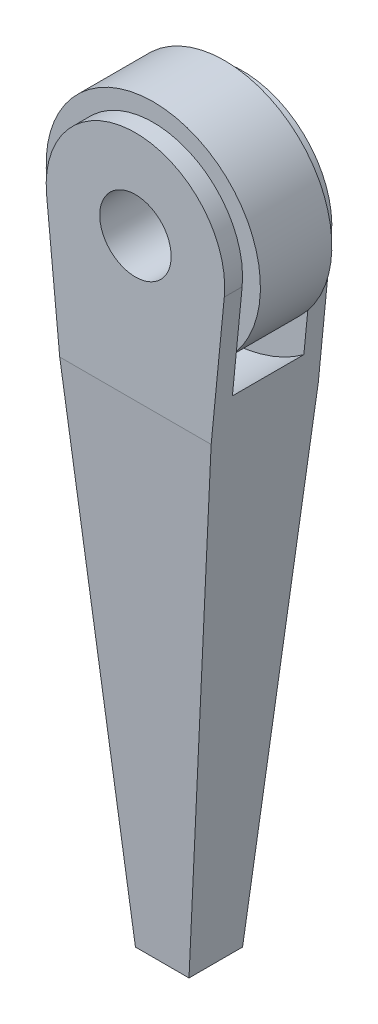
ISO-10303-21;
HEADER;
FILE_DESCRIPTION(('STEP AP214'),'2;1');
FILE_NAME('part.step','',(''),(''),'','','');
FILE_SCHEMA(('AUTOMOTIVE_DESIGN { 1 0 10303 214 1 1 1 1 }'));
ENDSEC;
DATA;
#1=APPLICATION_CONTEXT('core data for automotive mechanical design processes');
#2=APPLICATION_PROTOCOL_DEFINITION('international standard','automotive_design',2000,#1);
#3=PRODUCT_CONTEXT('',#1,'mechanical');
#4=PRODUCT('Part','Part','',(#3));
#5=PRODUCT_RELATED_PRODUCT_CATEGORY('part','',(#4));
#6=PRODUCT_DEFINITION_FORMATION('','',#4);
#7=PRODUCT_DEFINITION_CONTEXT('part definition',#1,'design');
#8=PRODUCT_DEFINITION('design','',#6,#7);
#9=PRODUCT_DEFINITION_SHAPE('','',#8);
#10=(LENGTH_UNIT() NAMED_UNIT(*) SI_UNIT(.MILLI.,.METRE.));
#11=(NAMED_UNIT(*) PLANE_ANGLE_UNIT() SI_UNIT($,.RADIAN.));
#12=(NAMED_UNIT(*) SI_UNIT($,.STERADIAN.) SOLID_ANGLE_UNIT());
#13=UNCERTAINTY_MEASURE_WITH_UNIT(LENGTH_MEASURE(1.E-05),#10,'distance_accuracy_value','');
#14=(GEOMETRIC_REPRESENTATION_CONTEXT(3) GLOBAL_UNCERTAINTY_ASSIGNED_CONTEXT((#13)) GLOBAL_UNIT_ASSIGNED_CONTEXT((#10,
#11,#12)) REPRESENTATION_CONTEXT('',''));
#15=CARTESIAN_POINT('',(0.,0.,0.));
#16=DIRECTION('',(0.,0.,1.));
#17=DIRECTION('',(1.,0.,0.));
#18=AXIS2_PLACEMENT_3D('',#15,#16,#17);
#19=CARTESIAN_POINT('',(-24.8810829533844,-2.43551043249787,15.));
#20=DIRECTION('',(-0.995243318135375,-0.097420417299915,0.));
#21=DIRECTION('',(0.097420417299915,-0.995243318135375,0.));
#22=AXIS2_PLACEMENT_3D('',#19,#20,#21);
#23=PLANE('',#22);
#24=DIRECTION('',(0.,0.,-1.));
#25=VECTOR('',#24,1.);
#26=CARTESIAN_POINT('',(-7.5,-180.,15.));
#27=LINE('',#26,#25);
#28=CARTESIAN_POINT('',(-7.5,-180.,7.5));
#29=VERTEX_POINT('',#28);
#30=CARTESIAN_POINT('',(-7.5,-180.,-7.5));
#31=VERTEX_POINT('',#30);
#32=EDGE_CURVE('E142',#29,#31,#27,.T.);
#33=ORIENTED_EDGE('',*,*,#32,.F.);
#34=DIRECTION('',(-0.0972822452258721,0.993831757425049,0.0532409870048649));
#35=VECTOR('',#34,1.);
#36=CARTESIAN_POINT('',(-24.8706600094176,-2.54199083594646,17.0066790623514));
#37=LINE('',#36,#35);
#38=CARTESIAN_POINT('',(-21.2040442005211,-40.,14.9999999999932));
#39=VERTEX_POINT('',#38);
#40=EDGE_CURVE('E180',#29,#39,#37,.T.);
#41=ORIENTED_EDGE('',*,*,#40,.T.);
#42=DIRECTION('',(-0.097420417299915,0.995243318135375,0.));
#43=VECTOR('',#42,1.);
#44=CARTESIAN_POINT('',(-24.8810829533844,-2.43551043249787,15.));
#45=LINE('',#44,#43);
#46=CARTESIAN_POINT('',(-24.8810829533844,-2.43551043249787,15.));
#47=VERTEX_POINT('',#46);
#48=EDGE_CURVE('E242',#39,#47,#45,.T.);
#49=ORIENTED_EDGE('',*,*,#48,.T.);
#50=DIRECTION('',(0.,0.,-1.));
#51=VECTOR('',#50,1.);
#52=CARTESIAN_POINT('',(-24.8810829533844,-2.43551043249787,15.));
#53=LINE('',#52,#51);
#54=CARTESIAN_POINT('',(-24.8810829533844,-2.43551043249787,10.));
#55=VERTEX_POINT('',#54);
#56=EDGE_CURVE('E155',#47,#55,#53,.T.);
#57=ORIENTED_EDGE('',*,*,#56,.T.);
#58=DIRECTION('',(-0.097420417299915,0.995243318135375,0.));
#59=VECTOR('',#58,1.);
#60=CARTESIAN_POINT('',(-24.8810829533844,-2.43551043249787,10.));
#61=LINE('',#60,#59);
#62=CARTESIAN_POINT('',(-23.265548097866,-18.9397537393146,10.));
#63=VERTEX_POINT('',#62);
#64=EDGE_CURVE('E191',#63,#55,#61,.T.);
#65=ORIENTED_EDGE('',*,*,#64,.F.);
#66=CARTESIAN_POINT('',(-22.1580995098968,-30.2534068512872,10.));
#67=VERTEX_POINT('',#66);
#68=EDGE_CURVE('E214',#67,#63,#61,.T.);
#69=ORIENTED_EDGE('',*,*,#68,.F.);
#70=DIRECTION('',(0.,0.,1.));
#71=VECTOR('',#70,1.);
#72=CARTESIAN_POINT('',(-22.1580995098968,-30.2534068512872,-10.));
#73=LINE('',#72,#71);
#74=CARTESIAN_POINT('',(-22.1580995098968,-30.2534068512872,-10.));
#75=VERTEX_POINT('',#74);
#76=EDGE_CURVE('E213',#75,#67,#73,.T.);
#77=ORIENTED_EDGE('',*,*,#76,.F.);
#78=DIRECTION('',(-0.097420417299915,0.995243318135375,0.));
#79=VECTOR('',#78,1.);
#80=CARTESIAN_POINT('',(-24.8810829533844,-2.43551043249787,-10.));
#81=LINE('',#80,#79);
#82=CARTESIAN_POINT('',(-23.265548097866,-18.9397537393146,-10.));
#83=VERTEX_POINT('',#82);
#84=EDGE_CURVE('E199',#75,#83,#81,.T.);
#85=ORIENTED_EDGE('',*,*,#84,.T.);
#86=CARTESIAN_POINT('',(-24.8810829533844,-2.43551043249787,-10.));
#87=VERTEX_POINT('',#86);
#88=EDGE_CURVE('E204',#83,#87,#81,.T.);
#89=ORIENTED_EDGE('',*,*,#88,.T.);
#90=CARTESIAN_POINT('',(-24.8810829533844,-2.43551043249787,-15.));
#91=VERTEX_POINT('',#90);
#92=EDGE_CURVE('E150',#87,#91,#53,.T.);
#93=ORIENTED_EDGE('',*,*,#92,.T.);
#94=DIRECTION('',(-0.097420417299915,0.995243318135375,0.));
#95=VECTOR('',#94,1.);
#96=CARTESIAN_POINT('',(-24.8810829533844,-2.43551043249787,-15.));
#97=LINE('',#96,#95);
#98=CARTESIAN_POINT('',(-21.2040442005211,-39.9999999998727,-15.));
#99=VERTEX_POINT('',#98);
#100=EDGE_CURVE('E144',#99,#91,#97,.T.);
#101=ORIENTED_EDGE('',*,*,#100,.F.);
#102=DIRECTION('',(-0.0972822452258721,0.993831757425049,-0.0532409870048649));
#103=VECTOR('',#102,1.);
#104=CARTESIAN_POINT('',(-24.7152779268014,-4.12936834640913,-16.9216409814338));
#105=LINE('',#104,#103);
#106=EDGE_CURVE('E63',#31,#99,#105,.T.);
#107=ORIENTED_EDGE('',*,*,#106,.F.);
#108=EDGE_LOOP('',(#33,#41,#49,#57,#65,#69,#77,#85,#89,#93,#101,#107));
#109=FACE_BOUND('',#108,.T.);
#110=ADVANCED_FACE('F40',(#109),#23,.T.);
#111=CARTESIAN_POINT('',(24.8810829533844,-2.43551043249787,15.));
#112=DIRECTION('',(0.995243318135375,-0.097420417299915,0.));
#113=DIRECTION('',(0.097420417299915,0.995243318135375,0.));
#114=AXIS2_PLACEMENT_3D('',#111,#112,#113);
#115=PLANE('',#114);
#116=DIRECTION('',(-0.097420417299915,-0.995243318135375,0.));
#117=VECTOR('',#116,1.);
#118=CARTESIAN_POINT('',(24.8810829533844,-2.43551043249787,15.));
#119=LINE('',#118,#117);
#120=CARTESIAN_POINT('',(24.8810829533844,-2.43551043249787,15.));
#121=VERTEX_POINT('',#120);
#122=CARTESIAN_POINT('',(21.2040442005211,-39.9999999998727,15.));
#123=VERTEX_POINT('',#122);
#124=EDGE_CURVE('E245',#121,#123,#119,.T.);
#125=ORIENTED_EDGE('',*,*,#124,.T.);
#126=DIRECTION('',(-0.0972822452258721,-0.993831757425049,-0.0532409870048649));
#127=VECTOR('',#126,1.);
#128=CARTESIAN_POINT('',(24.8706600094176,-2.54199083594646,17.0066790623514));
#129=LINE('',#128,#127);
#130=CARTESIAN_POINT('',(7.49999999999999,-180.,7.5));
#131=VERTEX_POINT('',#130);
#132=EDGE_CURVE('E56',#123,#131,#129,.T.);
#133=ORIENTED_EDGE('',*,*,#132,.T.);
#134=DIRECTION('',(0.,0.,-1.));
#135=VECTOR('',#134,1.);
#136=CARTESIAN_POINT('',(7.5,-180.,15.));
#137=LINE('',#136,#135);
#138=CARTESIAN_POINT('',(7.49999999999999,-180.,-7.5));
#139=VERTEX_POINT('',#138);
#140=EDGE_CURVE('E151',#131,#139,#137,.T.);
#141=ORIENTED_EDGE('',*,*,#140,.T.);
#142=DIRECTION('',(-0.0972822452258721,-0.993831757425049,0.0532409870048649));
#143=VECTOR('',#142,1.);
#144=CARTESIAN_POINT('',(24.7152779268014,-4.12936834640913,-16.9216409814338));
#145=LINE('',#144,#143);
#146=CARTESIAN_POINT('',(21.2040442005211,-40.,-14.9999999999932));
#147=VERTEX_POINT('',#146);
#148=EDGE_CURVE('E130',#147,#139,#145,.T.);
#149=ORIENTED_EDGE('',*,*,#148,.F.);
#150=DIRECTION('',(-0.097420417299915,-0.995243318135375,0.));
#151=VECTOR('',#150,1.);
#152=CARTESIAN_POINT('',(24.8810829533844,-2.43551043249787,-15.));
#153=LINE('',#152,#151);
#154=CARTESIAN_POINT('',(24.8810829533844,-2.43551043249787,-15.));
#155=VERTEX_POINT('',#154);
#156=EDGE_CURVE('E168',#155,#147,#153,.T.);
#157=ORIENTED_EDGE('',*,*,#156,.F.);
#158=DIRECTION('',(0.,0.,-1.));
#159=VECTOR('',#158,1.);
#160=CARTESIAN_POINT('',(24.8810829533844,-2.43551043249787,15.));
#161=LINE('',#160,#159);
#162=CARTESIAN_POINT('',(24.8810829533844,-2.43551043249787,-10.));
#163=VERTEX_POINT('',#162);
#164=EDGE_CURVE('E248',#163,#155,#161,.T.);
#165=ORIENTED_EDGE('',*,*,#164,.F.);
#166=DIRECTION('',(-0.097420417299915,-0.995243318135375,0.));
#167=VECTOR('',#166,1.);
#168=CARTESIAN_POINT('',(24.8810829533844,-2.43551043249787,-10.));
#169=LINE('',#168,#167);
#170=CARTESIAN_POINT('',(23.265548097866,-18.9397537393146,-10.));
#171=VERTEX_POINT('',#170);
#172=EDGE_CURVE('E209',#163,#171,#169,.T.);
#173=ORIENTED_EDGE('',*,*,#172,.T.);
#174=CARTESIAN_POINT('',(22.1580995098968,-30.2534068512872,-10.));
#175=VERTEX_POINT('',#174);
#176=EDGE_CURVE('E208',#171,#175,#169,.T.);
#177=ORIENTED_EDGE('',*,*,#176,.T.);
#178=DIRECTION('',(0.,0.,1.));
#179=VECTOR('',#178,1.);
#180=CARTESIAN_POINT('',(22.1580995098968,-30.2534068512872,-10.));
#181=LINE('',#180,#179);
#182=CARTESIAN_POINT('',(22.1580995098968,-30.2534068512872,10.));
#183=VERTEX_POINT('',#182);
#184=EDGE_CURVE('E226',#175,#183,#181,.T.);
#185=ORIENTED_EDGE('',*,*,#184,.T.);
#186=DIRECTION('',(-0.097420417299915,-0.995243318135375,0.));
#187=VECTOR('',#186,1.);
#188=CARTESIAN_POINT('',(24.8810829533844,-2.43551043249787,10.));
#189=LINE('',#188,#187);
#190=CARTESIAN_POINT('',(23.265548097866,-18.9397537393146,10.));
#191=VERTEX_POINT('',#190);
#192=EDGE_CURVE('E221',#191,#183,#189,.T.);
#193=ORIENTED_EDGE('',*,*,#192,.F.);
#194=CARTESIAN_POINT('',(24.8810829533844,-2.43551043249787,10.));
#195=VERTEX_POINT('',#194);
#196=EDGE_CURVE('E222',#195,#191,#189,.T.);
#197=ORIENTED_EDGE('',*,*,#196,.F.);
#198=EDGE_CURVE('E157',#121,#195,#161,.T.);
#199=ORIENTED_EDGE('',*,*,#198,.F.);
#200=EDGE_LOOP('',(#125,#133,#141,#149,#157,#165,#173,#177,#185,#193,#197,#199));
#201=FACE_BOUND('',#200,.T.);
#202=ADVANCED_FACE('F171',(#201),#115,.T.);
#203=CARTESIAN_POINT('',(0.,-180.,15.));
#204=DIRECTION('',(0.,1.,0.));
#205=DIRECTION('',(0.,0.,1.));
#206=AXIS2_PLACEMENT_3D('',#203,#204,#205);
#207=PLANE('',#206);
#208=DIRECTION('',(1.,0.,0.));
#209=VECTOR('',#208,1.);
#210=CARTESIAN_POINT('',(-30.,-180.,7.5));
#211=LINE('',#210,#209);
#212=EDGE_CURVE('E136',#29,#131,#211,.T.);
#213=ORIENTED_EDGE('',*,*,#212,.F.);
#214=ORIENTED_EDGE('',*,*,#32,.T.);
#215=DIRECTION('',(1.,0.,0.));
#216=VECTOR('',#215,1.);
#217=CARTESIAN_POINT('',(-30.,-180.,-7.5));
#218=LINE('',#217,#216);
#219=EDGE_CURVE('E127',#31,#139,#218,.T.);
#220=ORIENTED_EDGE('',*,*,#219,.T.);
#221=ORIENTED_EDGE('',*,*,#140,.F.);
#222=EDGE_LOOP('',(#213,#214,#220,#221));
#223=FACE_BOUND('',#222,.T.);
#224=ADVANCED_FACE('F148',(#223),#207,.F.);
#225=CARTESIAN_POINT('',(0.,0.,15.));
#226=DIRECTION('',(0.,0.,1.));
#227=DIRECTION('',(1.,0.,0.));
#228=AXIS2_PLACEMENT_3D('',#225,#226,#227);
#229=PLANE('',#228);
#230=CARTESIAN_POINT('',(0.,0.,15.));
#231=DIRECTION('',(0.,0.,1.));
#232=DIRECTION('',(1.,0.,0.));
#233=AXIS2_PLACEMENT_3D('',#230,#231,#232);
#234=CIRCLE('',#233,10.);
#235=CARTESIAN_POINT('',(10.,0.,15.));
#236=VERTEX_POINT('',#235);
#237=EDGE_CURVE('E234',#236,#236,#234,.T.);
#238=ORIENTED_EDGE('',*,*,#237,.F.);
#239=EDGE_LOOP('',(#238));
#240=FACE_BOUND('',#239,.T.);
#241=ORIENTED_EDGE('',*,*,#48,.F.);
#242=DIRECTION('',(1.,0.,0.));
#243=VECTOR('',#242,1.);
#244=CARTESIAN_POINT('',(0.,-39.9999999998727,15.));
#245=LINE('',#244,#243);
#246=EDGE_CURVE('E11',#39,#123,#245,.T.);
#247=ORIENTED_EDGE('',*,*,#246,.T.);
#248=ORIENTED_EDGE('',*,*,#124,.F.);
#249=CARTESIAN_POINT('',(0.,0.,15.));
#250=DIRECTION('',(0.,0.,1.));
#251=DIRECTION('',(1.,0.,0.));
#252=AXIS2_PLACEMENT_3D('',#249,#250,#251);
#253=CIRCLE('',#252,25.);
#254=EDGE_CURVE('E238',#121,#47,#253,.T.);
#255=ORIENTED_EDGE('',*,*,#254,.T.);
#256=EDGE_LOOP('',(#241,#247,#248,#255));
#257=FACE_BOUND('',#256,.T.);
#258=ADVANCED_FACE('F307',(#240,#257),#229,.T.);
#259=CARTESIAN_POINT('',(0.,0.,15.));
#260=DIRECTION('',(0.,0.,-1.));
#261=DIRECTION('',(-1.,0.,0.));
#262=AXIS2_PLACEMENT_3D('',#259,#260,#261);
#263=CYLINDRICAL_SURFACE('',#262,25.);
#264=CARTESIAN_POINT('',(0.,0.,-10.));
#265=DIRECTION('',(0.,0.,1.));
#266=DIRECTION('',(1.,0.,0.));
#267=AXIS2_PLACEMENT_3D('',#264,#265,#266);
#268=CIRCLE('',#267,25.);
#269=EDGE_CURVE('E196',#163,#87,#268,.T.);
#270=ORIENTED_EDGE('',*,*,#269,.F.);
#271=ORIENTED_EDGE('',*,*,#164,.T.);
#272=CARTESIAN_POINT('',(0.,0.,-15.));
#273=DIRECTION('',(0.,0.,1.));
#274=DIRECTION('',(1.,0.,0.));
#275=AXIS2_PLACEMENT_3D('',#272,#273,#274);
#276=CIRCLE('',#275,25.);
#277=EDGE_CURVE('E252',#155,#91,#276,.T.);
#278=ORIENTED_EDGE('',*,*,#277,.T.);
#279=ORIENTED_EDGE('',*,*,#92,.F.);
#280=EDGE_LOOP('',(#270,#271,#278,#279));
#281=FACE_BOUND('',#280,.T.);
#282=ADVANCED_FACE('F267',(#281),#263,.T.);
#283=CARTESIAN_POINT('',(0.,0.,-10.));
#284=DIRECTION('',(0.,0.,1.));
#285=DIRECTION('',(1.,0.,0.));
#286=AXIS2_PLACEMENT_3D('',#283,#284,#285);
#287=PLANE('',#286);
#288=ORIENTED_EDGE('',*,*,#176,.F.);
#289=CARTESIAN_POINT('',(0.,0.,-10.));
#290=DIRECTION('',(0.,0.,1.));
#291=DIRECTION('',(1.,0.,0.));
#292=AXIS2_PLACEMENT_3D('',#289,#290,#291);
#293=CIRCLE('',#292,30.);
#294=EDGE_CURVE('E192',#83,#171,#293,.T.);
#295=ORIENTED_EDGE('',*,*,#294,.F.);
#296=ORIENTED_EDGE('',*,*,#84,.F.);
#297=CARTESIAN_POINT('',(0.,0.,-10.));
#298=DIRECTION('',(0.,0.,1.));
#299=DIRECTION('',(1.,0.,0.));
#300=AXIS2_PLACEMENT_3D('',#297,#298,#299);
#301=CIRCLE('',#300,37.5);
#302=EDGE_CURVE('E203',#75,#175,#301,.T.);
#303=ORIENTED_EDGE('',*,*,#302,.T.);
#304=EDGE_LOOP('',(#288,#295,#296,#303));
#305=FACE_BOUND('',#304,.T.);
#306=ADVANCED_FACE('F280',(#305),#287,.T.);
#307=CARTESIAN_POINT('',(0.,0.,10.));
#308=DIRECTION('',(0.,0.,1.));
#309=DIRECTION('',(1.,0.,0.));
#310=AXIS2_PLACEMENT_3D('',#307,#308,#309);
#311=PLANE('',#310);
#312=CARTESIAN_POINT('',(0.,0.,10.));
#313=DIRECTION('',(0.,0.,1.));
#314=DIRECTION('',(1.,0.,0.));
#315=AXIS2_PLACEMENT_3D('',#312,#313,#314);
#316=CIRCLE('',#315,30.);
#317=EDGE_CURVE('E184',#63,#191,#316,.T.);
#318=ORIENTED_EDGE('',*,*,#317,.T.);
#319=ORIENTED_EDGE('',*,*,#192,.T.);
#320=CARTESIAN_POINT('',(0.,0.,10.));
#321=DIRECTION('',(0.,0.,1.));
#322=DIRECTION('',(1.,0.,0.));
#323=AXIS2_PLACEMENT_3D('',#320,#321,#322);
#324=CIRCLE('',#323,37.5);
#325=EDGE_CURVE('E217',#67,#183,#324,.T.);
#326=ORIENTED_EDGE('',*,*,#325,.F.);
#327=ORIENTED_EDGE('',*,*,#68,.T.);
#328=EDGE_LOOP('',(#318,#319,#326,#327));
#329=FACE_BOUND('',#328,.T.);
#330=ADVANCED_FACE('F297',(#329),#311,.F.);
#331=ORIENTED_EDGE('',*,*,#198,.T.);
#332=CARTESIAN_POINT('',(0.,0.,10.));
#333=DIRECTION('',(0.,0.,1.));
#334=DIRECTION('',(1.,0.,0.));
#335=AXIS2_PLACEMENT_3D('',#332,#333,#334);
#336=CIRCLE('',#335,25.);
#337=EDGE_CURVE('E187',#195,#55,#336,.T.);
#338=ORIENTED_EDGE('',*,*,#337,.T.);
#339=ORIENTED_EDGE('',*,*,#56,.F.);
#340=ORIENTED_EDGE('',*,*,#254,.F.);
#341=EDGE_LOOP('',(#331,#338,#339,#340));
#342=FACE_BOUND('',#341,.T.);
#343=ADVANCED_FACE('F304',(#342),#263,.T.);
#344=CARTESIAN_POINT('',(0.,0.,15.));
#345=DIRECTION('',(0.,0.,-1.));
#346=DIRECTION('',(-1.,0.,0.));
#347=AXIS2_PLACEMENT_3D('',#344,#345,#346);
#348=CYLINDRICAL_SURFACE('',#347,10.);
#349=ORIENTED_EDGE('',*,*,#237,.T.);
#350=EDGE_LOOP('',(#349));
#351=FACE_BOUND('',#350,.T.);
#352=CARTESIAN_POINT('',(0.,0.,-15.));
#353=DIRECTION('',(0.,0.,1.));
#354=DIRECTION('',(1.,0.,0.));
#355=AXIS2_PLACEMENT_3D('',#352,#353,#354);
#356=CIRCLE('',#355,10.);
#357=CARTESIAN_POINT('',(10.,0.,-15.));
#358=VERTEX_POINT('',#357);
#359=EDGE_CURVE('E230',#358,#358,#356,.T.);
#360=ORIENTED_EDGE('',*,*,#359,.F.);
#361=EDGE_LOOP('',(#360));
#362=FACE_BOUND('',#361,.T.);
#363=ADVANCED_FACE('F42',(#351,#362),#348,.F.);
#364=CARTESIAN_POINT('',(0.,0.,-15.));
#365=DIRECTION('',(0.,0.,1.));
#366=DIRECTION('',(1.,0.,0.));
#367=AXIS2_PLACEMENT_3D('',#364,#365,#366);
#368=PLANE('',#367);
#369=ORIENTED_EDGE('',*,*,#359,.T.);
#370=EDGE_LOOP('',(#369));
#371=FACE_BOUND('',#370,.T.);
#372=ORIENTED_EDGE('',*,*,#156,.T.);
#373=DIRECTION('',(-1.,0.,0.));
#374=VECTOR('',#373,1.);
#375=CARTESIAN_POINT('',(0.,-39.9999999998727,-15.));
#376=LINE('',#375,#374);
#377=EDGE_CURVE('E49',#147,#99,#376,.T.);
#378=ORIENTED_EDGE('',*,*,#377,.T.);
#379=ORIENTED_EDGE('',*,*,#100,.T.);
#380=ORIENTED_EDGE('',*,*,#277,.F.);
#381=EDGE_LOOP('',(#372,#378,#379,#380));
#382=FACE_BOUND('',#381,.T.);
#383=ADVANCED_FACE('F165',(#371,#382),#368,.F.);
#384=CARTESIAN_POINT('',(0.,0.,-10.));
#385=DIRECTION('',(0.,0.,1.));
#386=DIRECTION('',(1.,0.,0.));
#387=AXIS2_PLACEMENT_3D('',#384,#385,#386);
#388=CYLINDRICAL_SURFACE('',#387,37.5);
#389=ORIENTED_EDGE('',*,*,#325,.T.);
#390=ORIENTED_EDGE('',*,*,#184,.F.);
#391=ORIENTED_EDGE('',*,*,#302,.F.);
#392=ORIENTED_EDGE('',*,*,#76,.T.);
#393=EDGE_LOOP('',(#389,#390,#391,#392));
#394=FACE_BOUND('',#393,.T.);
#395=ADVANCED_FACE('F300',(#394),#388,.F.);
#396=CARTESIAN_POINT('',(0.,0.,10.));
#397=DIRECTION('',(0.,0.,-1.));
#398=DIRECTION('',(-1.,0.,0.));
#399=AXIS2_PLACEMENT_3D('',#396,#397,#398);
#400=CYLINDRICAL_SURFACE('',#399,30.);
#401=ORIENTED_EDGE('',*,*,#317,.F.);
#402=EDGE_CURVE('E188',#191,#63,#316,.T.);
#403=ORIENTED_EDGE('',*,*,#402,.F.);
#404=EDGE_LOOP('',(#401,#403));
#405=FACE_BOUND('',#404,.T.);
#406=ORIENTED_EDGE('',*,*,#294,.T.);
#407=EDGE_CURVE('E183',#171,#83,#293,.T.);
#408=ORIENTED_EDGE('',*,*,#407,.T.);
#409=EDGE_LOOP('',(#406,#408));
#410=FACE_BOUND('',#409,.T.);
#411=ADVANCED_FACE('F278',(#405,#410),#400,.T.);
#412=CARTESIAN_POINT('',(0.,0.,10.));
#413=DIRECTION('',(0.,0.,1.));
#414=DIRECTION('',(1.,0.,0.));
#415=AXIS2_PLACEMENT_3D('',#412,#413,#414);
#416=PLANE('',#415);
#417=ORIENTED_EDGE('',*,*,#402,.T.);
#418=ORIENTED_EDGE('',*,*,#64,.T.);
#419=ORIENTED_EDGE('',*,*,#337,.F.);
#420=ORIENTED_EDGE('',*,*,#196,.T.);
#421=EDGE_LOOP('',(#417,#418,#419,#420));
#422=FACE_BOUND('',#421,.T.);
#423=ADVANCED_FACE('F292',(#422),#416,.T.);
#424=CARTESIAN_POINT('',(0.,0.,-10.));
#425=DIRECTION('',(0.,0.,1.));
#426=DIRECTION('',(1.,0.,0.));
#427=AXIS2_PLACEMENT_3D('',#424,#425,#426);
#428=PLANE('',#427);
#429=ORIENTED_EDGE('',*,*,#88,.F.);
#430=ORIENTED_EDGE('',*,*,#407,.F.);
#431=ORIENTED_EDGE('',*,*,#172,.F.);
#432=ORIENTED_EDGE('',*,*,#269,.T.);
#433=EDGE_LOOP('',(#429,#430,#431,#432));
#434=FACE_BOUND('',#433,.T.);
#435=ADVANCED_FACE('F273',(#434),#428,.F.);
#436=CARTESIAN_POINT('',(-30.,-0.915739268679149,-17.0937996820263));
#437=DIRECTION('',(0.,0.0534947213715634,0.998568132270092));
#438=DIRECTION('',(0.,-0.998568132270092,0.0534947213715634));
#439=AXIS2_PLACEMENT_3D('',#436,#437,#438);
#440=PLANE('',#439);
#441=ORIENTED_EDGE('',*,*,#106,.T.);
#442=ORIENTED_EDGE('',*,*,#377,.F.);
#443=ORIENTED_EDGE('',*,*,#148,.T.);
#444=ORIENTED_EDGE('',*,*,#219,.F.);
#445=EDGE_LOOP('',(#441,#442,#443,#444));
#446=FACE_BOUND('',#445,.T.);
#447=ADVANCED_FACE('F128',(#446),#440,.F.);
#448=CARTESIAN_POINT('',(-30.,-0.915739268679149,17.0937996820263));
#449=DIRECTION('',(0.,-0.0534947213715634,0.998568132270092));
#450=DIRECTION('',(0.,-0.998568132270092,-0.0534947213715634));
#451=AXIS2_PLACEMENT_3D('',#448,#449,#450);
#452=PLANE('',#451);
#453=ORIENTED_EDGE('',*,*,#212,.T.);
#454=ORIENTED_EDGE('',*,*,#132,.F.);
#455=ORIENTED_EDGE('',*,*,#246,.F.);
#456=ORIENTED_EDGE('',*,*,#40,.F.);
#457=EDGE_LOOP('',(#453,#454,#455,#456));
#458=FACE_BOUND('',#457,.T.);
#459=ADVANCED_FACE('F308',(#458),#452,.T.);
#460=CLOSED_SHELL('',(#110,#202,#224,#258,#282,#306,#330,#343,#363,#383,#395,#411,#423,#435,
#447,#459));
#461=MANIFOLD_SOLID_BREP('B2',#460);
#462=ADVANCED_BREP_SHAPE_REPRESENTATION('',(#18,#461),#14);
#463=SHAPE_DEFINITION_REPRESENTATION(#9,#462);
ENDSEC;
END-ISO-10303-21;
